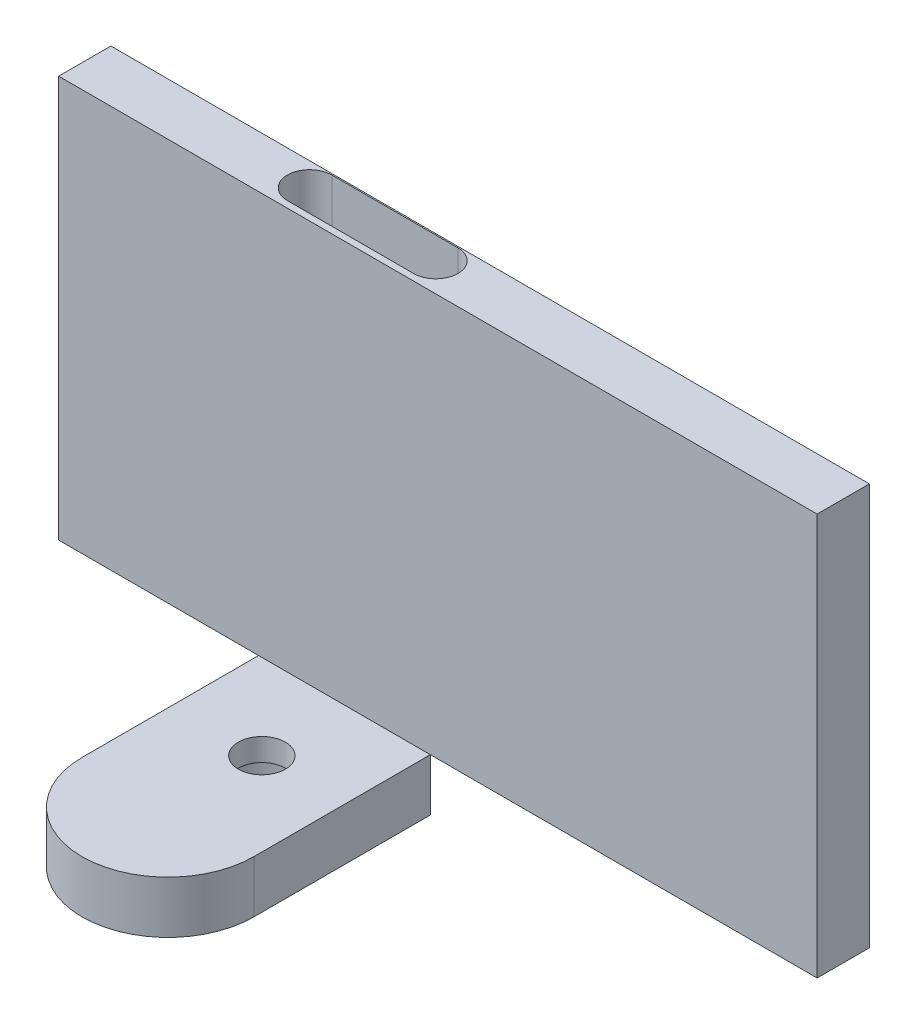
ISO-10303-21;
HEADER;
FILE_DESCRIPTION(('STEP AP214'),'2;1');
FILE_NAME('part.step','',(''),(''),'','','');
FILE_SCHEMA(('AUTOMOTIVE_DESIGN { 1 0 10303 214 1 1 1 1 }'));
ENDSEC;
DATA;
#1=APPLICATION_CONTEXT('core data for automotive mechanical design processes');
#2=APPLICATION_PROTOCOL_DEFINITION('international standard','automotive_design',2000,#1);
#3=PRODUCT_CONTEXT('',#1,'mechanical');
#4=PRODUCT('Part','Part','',(#3));
#5=PRODUCT_RELATED_PRODUCT_CATEGORY('part','',(#4));
#6=PRODUCT_DEFINITION_FORMATION('','',#4);
#7=PRODUCT_DEFINITION_CONTEXT('part definition',#1,'design');
#8=PRODUCT_DEFINITION('design','',#6,#7);
#9=PRODUCT_DEFINITION_SHAPE('','',#8);
#10=(LENGTH_UNIT() NAMED_UNIT(*) SI_UNIT(.MILLI.,.METRE.));
#11=(NAMED_UNIT(*) PLANE_ANGLE_UNIT() SI_UNIT($,.RADIAN.));
#12=(NAMED_UNIT(*) SI_UNIT($,.STERADIAN.) SOLID_ANGLE_UNIT());
#13=UNCERTAINTY_MEASURE_WITH_UNIT(LENGTH_MEASURE(1.E-05),#10,'distance_accuracy_value','');
#14=(GEOMETRIC_REPRESENTATION_CONTEXT(3) GLOBAL_UNCERTAINTY_ASSIGNED_CONTEXT((#13)) GLOBAL_UNIT_ASSIGNED_CONTEXT((#10,
#11,#12)) REPRESENTATION_CONTEXT('',''));
#15=CARTESIAN_POINT('',(0.,0.,0.));
#16=DIRECTION('',(0.,0.,1.));
#17=DIRECTION('',(1.,0.,0.));
#18=AXIS2_PLACEMENT_3D('',#15,#16,#17);
#19=CARTESIAN_POINT('',(0.,0.,0.));
#20=DIRECTION('',(0.,0.,1.));
#21=DIRECTION('',(1.,0.,0.));
#22=AXIS2_PLACEMENT_3D('',#19,#20,#21);
#23=PLANE('',#22);
#24=DIRECTION('',(-1.,0.,0.));
#25=VECTOR('',#24,1.);
#26=CARTESIAN_POINT('',(74.0729850972046,-35.4512730231758,0.));
#27=LINE('',#26,#25);
#28=CARTESIAN_POINT('',(74.0729850972046,-35.4512730231758,0.));
#29=VERTEX_POINT('',#28);
#30=CARTESIAN_POINT('',(-71.1907677782473,-35.4512730231758,0.));
#31=VERTEX_POINT('',#30);
#32=EDGE_CURVE('E408',#29,#31,#27,.T.);
#33=ORIENTED_EDGE('',*,*,#32,.T.);
#34=DIRECTION('',(0.,-1.,0.));
#35=VECTOR('',#34,1.);
#36=CARTESIAN_POINT('',(-71.1907677782473,41.5039293929862,0.));
#37=LINE('',#36,#35);
#38=CARTESIAN_POINT('',(-71.1907677782473,41.5039293929862,0.));
#39=VERTEX_POINT('',#38);
#40=EDGE_CURVE('E423',#39,#31,#37,.T.);
#41=ORIENTED_EDGE('',*,*,#40,.F.);
#42=DIRECTION('',(-1.,0.,0.));
#43=VECTOR('',#42,1.);
#44=CARTESIAN_POINT('',(74.0729850972046,41.5039293929862,0.));
#45=LINE('',#44,#43);
#46=CARTESIAN_POINT('',(74.0729850972046,41.5039293929862,0.));
#47=VERTEX_POINT('',#46);
#48=EDGE_CURVE('E426',#47,#39,#45,.T.);
#49=ORIENTED_EDGE('',*,*,#48,.F.);
#50=DIRECTION('',(0.,-1.,0.));
#51=VECTOR('',#50,1.);
#52=CARTESIAN_POINT('',(74.0729850972046,41.5039293929862,0.));
#53=LINE('',#52,#51);
#54=EDGE_CURVE('E428',#47,#29,#53,.T.);
#55=ORIENTED_EDGE('',*,*,#54,.T.);
#56=EDGE_LOOP('',(#33,#41,#49,#55));
#57=FACE_BOUND('',#56,.T.);
#58=ADVANCED_FACE('F189',(#57),#23,.F.);
#59=CARTESIAN_POINT('',(74.0729850972046,-35.4512730231758,10.));
#60=DIRECTION('',(0.,-1.,0.));
#61=DIRECTION('',(0.,0.,-1.));
#62=AXIS2_PLACEMENT_3D('',#59,#60,#61);
#63=PLANE('',#62);
#64=CARTESIAN_POINT('',(-4.46762105633167,-35.4512730231758,4.49213155720221));
#65=DIRECTION('',(0.,-1.,0.));
#66=DIRECTION('',(0.,0.,-1.));
#67=AXIS2_PLACEMENT_3D('',#64,#65,#66);
#68=CIRCLE('',#67,4.275);
#69=CARTESIAN_POINT('',(-4.46762105633167,-35.4512730231758,0.21713155720221));
#70=VERTEX_POINT('',#69);
#71=CARTESIAN_POINT('',(-4.46762105633167,-35.4512730231758,8.76713155720222));
#72=VERTEX_POINT('',#71);
#73=EDGE_CURVE('E303',#70,#72,#68,.T.);
#74=ORIENTED_EDGE('',*,*,#73,.F.);
#75=DIRECTION('',(1.,0.,0.));
#76=VECTOR('',#75,1.);
#77=CARTESIAN_POINT('',(-28.6420150724124,-35.4512730231758,0.21713155720221));
#78=LINE('',#77,#76);
#79=CARTESIAN_POINT('',(-28.6420150724124,-35.4512730231758,0.217131557202214));
#80=VERTEX_POINT('',#79);
#81=EDGE_CURVE('E334',#80,#70,#78,.T.);
#82=ORIENTED_EDGE('',*,*,#81,.F.);
#83=CARTESIAN_POINT('',(-28.6420150724124,-35.4512730231758,4.49213155720221));
#84=DIRECTION('',(0.,-1.,0.));
#85=DIRECTION('',(0.,0.,-1.));
#86=AXIS2_PLACEMENT_3D('',#83,#84,#85);
#87=CIRCLE('',#86,4.275);
#88=CARTESIAN_POINT('',(-28.6420150724124,-35.4512730231758,8.76713155720222));
#89=VERTEX_POINT('',#88);
#90=EDGE_CURVE('E206',#89,#80,#87,.T.);
#91=ORIENTED_EDGE('',*,*,#90,.F.);
#92=DIRECTION('',(1.,0.,0.));
#93=VECTOR('',#92,1.);
#94=CARTESIAN_POINT('',(-28.6420150724124,-35.4512730231758,8.76713155720222));
#95=LINE('',#94,#93);
#96=EDGE_CURVE('E298',#89,#72,#95,.T.);
#97=ORIENTED_EDGE('',*,*,#96,.T.);
#98=EDGE_LOOP('',(#74,#82,#91,#97));
#99=FACE_BOUND('',#98,.T.);
#100=DIRECTION('',(0.,0.,-1.));
#101=VECTOR('',#100,1.);
#102=CARTESIAN_POINT('',(-71.1907677782473,-35.4512730231758,10.));
#103=LINE('',#102,#101);
#104=CARTESIAN_POINT('',(-71.1907677782473,-35.4512730231758,10.));
#105=VERTEX_POINT('',#104);
#106=EDGE_CURVE('E421',#105,#31,#103,.T.);
#107=ORIENTED_EDGE('',*,*,#106,.T.);
#108=ORIENTED_EDGE('',*,*,#32,.F.);
#109=DIRECTION('',(0.,0.,-1.));
#110=VECTOR('',#109,1.);
#111=CARTESIAN_POINT('',(74.0729850972046,-35.4512730231758,10.));
#112=LINE('',#111,#110);
#113=CARTESIAN_POINT('',(74.0729850972046,-35.4512730231758,10.));
#114=VERTEX_POINT('',#113);
#115=EDGE_CURVE('E13',#114,#29,#112,.T.);
#116=ORIENTED_EDGE('',*,*,#115,.F.);
#117=DIRECTION('',(-1.,0.,0.));
#118=VECTOR('',#117,1.);
#119=CARTESIAN_POINT('',(74.0729850972046,-35.4512730231758,10.));
#120=LINE('',#119,#118);
#121=CARTESIAN_POINT('',(0.,-35.4512730231758,10.));
#122=VERTEX_POINT('',#121);
#123=EDGE_CURVE('E409',#114,#122,#120,.T.);
#124=ORIENTED_EDGE('',*,*,#123,.T.);
#125=DIRECTION('',(-1.,0.,0.));
#126=VECTOR('',#125,1.);
#127=CARTESIAN_POINT('',(-32.9040586827723,-35.4512730231758,10.));
#128=LINE('',#127,#126);
#129=CARTESIAN_POINT('',(-32.9040586827723,-35.4512730231758,10.));
#130=VERTEX_POINT('',#129);
#131=EDGE_CURVE('E359',#122,#130,#128,.T.);
#132=ORIENTED_EDGE('',*,*,#131,.T.);
#133=EDGE_CURVE('E413',#130,#105,#120,.T.);
#134=ORIENTED_EDGE('',*,*,#133,.T.);
#135=EDGE_LOOP('',(#107,#108,#116,#124,#132,#134));
#136=FACE_BOUND('',#135,.T.);
#137=ADVANCED_FACE('F191',(#99,#136),#63,.T.);
#138=CARTESIAN_POINT('',(0.,0.,10.));
#139=DIRECTION('',(0.,0.,1.));
#140=DIRECTION('',(1.,0.,0.));
#141=AXIS2_PLACEMENT_3D('',#138,#139,#140);
#142=PLANE('',#141);
#143=DIRECTION('',(1.,0.,0.));
#144=VECTOR('',#143,1.);
#145=CARTESIAN_POINT('',(0.,-35.4511730231758,10.));
#146=LINE('',#145,#144);
#147=CARTESIAN_POINT('',(-32.9040586827723,-35.4511730231758,10.));
#148=VERTEX_POINT('',#147);
#149=CARTESIAN_POINT('',(0.,-35.4511730231758,10.));
#150=VERTEX_POINT('',#149);
#151=EDGE_CURVE('E397',#148,#150,#146,.T.);
#152=ORIENTED_EDGE('',*,*,#151,.T.);
#153=DIRECTION('',(0.,-1.,0.));
#154=VECTOR('',#153,1.);
#155=CARTESIAN_POINT('',(0.,0.,10.));
#156=LINE('',#155,#154);
#157=EDGE_CURVE('E405',#150,#122,#156,.T.);
#158=ORIENTED_EDGE('',*,*,#157,.T.);
#159=ORIENTED_EDGE('',*,*,#123,.F.);
#160=DIRECTION('',(0.,-1.,0.));
#161=VECTOR('',#160,1.);
#162=CARTESIAN_POINT('',(74.0729850972046,41.5039293929862,10.));
#163=LINE('',#162,#161);
#164=CARTESIAN_POINT('',(74.0729850972046,41.5039293929862,10.));
#165=VERTEX_POINT('',#164);
#166=EDGE_CURVE('E418',#165,#114,#163,.T.);
#167=ORIENTED_EDGE('',*,*,#166,.F.);
#168=DIRECTION('',(-1.,0.,0.));
#169=VECTOR('',#168,1.);
#170=CARTESIAN_POINT('',(74.0729850972046,41.5039293929862,10.));
#171=LINE('',#170,#169);
#172=CARTESIAN_POINT('',(-71.1907677782473,41.5039293929862,10.));
#173=VERTEX_POINT('',#172);
#174=EDGE_CURVE('E416',#165,#173,#171,.T.);
#175=ORIENTED_EDGE('',*,*,#174,.T.);
#176=DIRECTION('',(0.,-1.,0.));
#177=VECTOR('',#176,1.);
#178=CARTESIAN_POINT('',(-71.1907677782473,41.5039293929862,10.));
#179=LINE('',#178,#177);
#180=EDGE_CURVE('E412',#173,#105,#179,.T.);
#181=ORIENTED_EDGE('',*,*,#180,.T.);
#182=ORIENTED_EDGE('',*,*,#133,.F.);
#183=DIRECTION('',(0.,1.,0.));
#184=VECTOR('',#183,1.);
#185=CARTESIAN_POINT('',(-32.9040586827723,0.,10.));
#186=LINE('',#185,#184);
#187=EDGE_CURVE('E402',#130,#148,#186,.T.);
#188=ORIENTED_EDGE('',*,*,#187,.T.);
#189=EDGE_LOOP('',(#152,#158,#159,#167,#175,#181,#182,#188));
#190=FACE_BOUND('',#189,.T.);
#191=ADVANCED_FACE('F452',(#190),#142,.T.);
#192=CARTESIAN_POINT('',(74.0729850972046,41.5039293929862,10.));
#193=DIRECTION('',(1.,0.,0.));
#194=DIRECTION('',(0.,0.,-1.));
#195=AXIS2_PLACEMENT_3D('',#192,#193,#194);
#196=PLANE('',#195);
#197=ORIENTED_EDGE('',*,*,#54,.F.);
#198=DIRECTION('',(0.,0.,-1.));
#199=VECTOR('',#198,1.);
#200=CARTESIAN_POINT('',(74.0729850972046,41.5039293929862,10.));
#201=LINE('',#200,#199);
#202=EDGE_CURVE('E198',#165,#47,#201,.T.);
#203=ORIENTED_EDGE('',*,*,#202,.F.);
#204=ORIENTED_EDGE('',*,*,#166,.T.);
#205=ORIENTED_EDGE('',*,*,#115,.T.);
#206=EDGE_LOOP('',(#197,#203,#204,#205));
#207=FACE_BOUND('',#206,.T.);
#208=ADVANCED_FACE('F447',(#207),#196,.T.);
#209=CARTESIAN_POINT('',(74.0729850972046,41.5039293929862,10.));
#210=DIRECTION('',(0.,-1.,0.));
#211=DIRECTION('',(0.,0.,-1.));
#212=AXIS2_PLACEMENT_3D('',#209,#210,#211);
#213=PLANE('',#212);
#214=DIRECTION('',(1.,0.,0.));
#215=VECTOR('',#214,1.);
#216=CARTESIAN_POINT('',(-28.6420150724124,41.5039293929862,0.242131557202224));
#217=LINE('',#216,#215);
#218=CARTESIAN_POINT('',(-28.6420150724124,41.5039293929862,0.242131557202224));
#219=VERTEX_POINT('',#218);
#220=CARTESIAN_POINT('',(-4.46762105633169,41.5039293929862,0.242131557202223));
#221=VERTEX_POINT('',#220);
#222=EDGE_CURVE('E338',#219,#221,#217,.T.);
#223=ORIENTED_EDGE('',*,*,#222,.T.);
#224=CARTESIAN_POINT('',(-4.46762105633167,41.5039293929862,4.49213155720221));
#225=DIRECTION('',(0.,-1.,0.));
#226=DIRECTION('',(0.,0.,-1.));
#227=AXIS2_PLACEMENT_3D('',#224,#225,#226);
#228=CIRCLE('',#227,4.24999999999999);
#229=CARTESIAN_POINT('',(-4.46762105633167,41.5039293929862,8.7421315572022));
#230=VERTEX_POINT('',#229);
#231=EDGE_CURVE('E316',#221,#230,#228,.T.);
#232=ORIENTED_EDGE('',*,*,#231,.T.);
#233=DIRECTION('',(1.,0.,0.));
#234=VECTOR('',#233,1.);
#235=CARTESIAN_POINT('',(-28.6420150724124,41.5039293929862,8.7421315572022));
#236=LINE('',#235,#234);
#237=CARTESIAN_POINT('',(-28.6420150724124,41.5039293929862,8.7421315572022));
#238=VERTEX_POINT('',#237);
#239=EDGE_CURVE('E340',#238,#230,#236,.T.);
#240=ORIENTED_EDGE('',*,*,#239,.F.);
#241=CARTESIAN_POINT('',(-28.6420150724124,41.5039293929862,4.49213155720221));
#242=DIRECTION('',(0.,-1.,0.));
#243=DIRECTION('',(0.,0.,-1.));
#244=AXIS2_PLACEMENT_3D('',#241,#242,#243);
#245=CIRCLE('',#244,4.24999999999999);
#246=EDGE_CURVE('E351',#238,#219,#245,.T.);
#247=ORIENTED_EDGE('',*,*,#246,.T.);
#248=EDGE_LOOP('',(#223,#232,#240,#247));
#249=FACE_BOUND('',#248,.T.);
#250=ORIENTED_EDGE('',*,*,#48,.T.);
#251=DIRECTION('',(0.,0.,-1.));
#252=VECTOR('',#251,1.);
#253=CARTESIAN_POINT('',(-71.1907677782473,41.5039293929862,10.));
#254=LINE('',#253,#252);
#255=EDGE_CURVE('E432',#173,#39,#254,.T.);
#256=ORIENTED_EDGE('',*,*,#255,.F.);
#257=ORIENTED_EDGE('',*,*,#174,.F.);
#258=ORIENTED_EDGE('',*,*,#202,.T.);
#259=EDGE_LOOP('',(#250,#256,#257,#258));
#260=FACE_BOUND('',#259,.T.);
#261=ADVANCED_FACE('F470',(#249,#260),#213,.F.);
#262=CARTESIAN_POINT('',(-71.1907677782473,41.5039293929862,10.));
#263=DIRECTION('',(1.,0.,0.));
#264=DIRECTION('',(0.,0.,-1.));
#265=AXIS2_PLACEMENT_3D('',#262,#263,#264);
#266=PLANE('',#265);
#267=ORIENTED_EDGE('',*,*,#40,.T.);
#268=ORIENTED_EDGE('',*,*,#106,.F.);
#269=ORIENTED_EDGE('',*,*,#180,.F.);
#270=ORIENTED_EDGE('',*,*,#255,.T.);
#271=EDGE_LOOP('',(#267,#268,#269,#270));
#272=FACE_BOUND('',#271,.T.);
#273=ADVANCED_FACE('F441',(#272),#266,.F.);
#274=CARTESIAN_POINT('',(-16.4520293413862,-35.4511730231758,43.814743914188));
#275=DIRECTION('',(0.,-1.,0.));
#276=DIRECTION('',(0.,0.,-1.));
#277=AXIS2_PLACEMENT_3D('',#274,#275,#276);
#278=CYLINDRICAL_SURFACE('',#277,16.4520293413862);
#279=DIRECTION('',(0.,-1.,0.));
#280=VECTOR('',#279,1.);
#281=CARTESIAN_POINT('',(-32.9040586827723,-35.4511730231758,43.814743914188));
#282=LINE('',#281,#280);
#283=CARTESIAN_POINT('',(-32.9040586827723,-35.4511730231758,43.814743914188));
#284=VERTEX_POINT('',#283);
#285=CARTESIAN_POINT('',(-32.9040586827723,-45.4512730231758,43.814743914188));
#286=VERTEX_POINT('',#285);
#287=EDGE_CURVE('E394',#284,#286,#282,.T.);
#288=ORIENTED_EDGE('',*,*,#287,.T.);
#289=CARTESIAN_POINT('',(-16.4520293413862,-45.4512730231758,43.814743914188));
#290=DIRECTION('',(0.,-1.,0.));
#291=DIRECTION('',(0.,0.,-1.));
#292=AXIS2_PLACEMENT_3D('',#289,#290,#291);
#293=CIRCLE('',#292,16.4520293413862);
#294=CARTESIAN_POINT('',(0.,-45.4512730231758,43.814743914188));
#295=VERTEX_POINT('',#294);
#296=EDGE_CURVE('E379',#286,#295,#293,.F.);
#297=ORIENTED_EDGE('',*,*,#296,.T.);
#298=DIRECTION('',(0.,-1.,0.));
#299=VECTOR('',#298,1.);
#300=CARTESIAN_POINT('',(0.,-35.4511730231758,43.814743914188));
#301=LINE('',#300,#299);
#302=CARTESIAN_POINT('',(0.,-35.4511730231758,43.814743914188));
#303=VERTEX_POINT('',#302);
#304=EDGE_CURVE('E395',#303,#295,#301,.T.);
#305=ORIENTED_EDGE('',*,*,#304,.F.);
#306=CARTESIAN_POINT('',(-16.4520293413862,-35.4511730231758,43.814743914188));
#307=DIRECTION('',(0.,-1.,0.));
#308=DIRECTION('',(0.,0.,-1.));
#309=AXIS2_PLACEMENT_3D('',#306,#307,#308);
#310=CIRCLE('',#309,16.4520293413862);
#311=EDGE_CURVE('E387',#284,#303,#310,.F.);
#312=ORIENTED_EDGE('',*,*,#311,.F.);
#313=EDGE_LOOP('',(#288,#297,#305,#312));
#314=FACE_BOUND('',#313,.T.);
#315=ADVANCED_FACE('F478',(#314),#278,.T.);
#316=CARTESIAN_POINT('',(0.,-35.4511730231758,0.));
#317=DIRECTION('',(-1.,0.,0.));
#318=DIRECTION('',(0.,0.,1.));
#319=AXIS2_PLACEMENT_3D('',#316,#317,#318);
#320=PLANE('',#319);
#321=DIRECTION('',(0.,0.,-1.));
#322=VECTOR('',#321,1.);
#323=CARTESIAN_POINT('',(0.,-45.4512730231758,0.));
#324=LINE('',#323,#322);
#325=CARTESIAN_POINT('',(0.,-45.4512730231758,10.));
#326=VERTEX_POINT('',#325);
#327=EDGE_CURVE('E384',#295,#326,#324,.T.);
#328=ORIENTED_EDGE('',*,*,#327,.T.);
#329=DIRECTION('',(0.,-1.,0.));
#330=VECTOR('',#329,1.);
#331=CARTESIAN_POINT('',(0.,-35.4512730231758,10.));
#332=LINE('',#331,#330);
#333=EDGE_CURVE('E214',#122,#326,#332,.T.);
#334=ORIENTED_EDGE('',*,*,#333,.F.);
#335=ORIENTED_EDGE('',*,*,#157,.F.);
#336=DIRECTION('',(0.,0.,-1.));
#337=VECTOR('',#336,1.);
#338=CARTESIAN_POINT('',(0.,-35.4511730231758,0.));
#339=LINE('',#338,#337);
#340=EDGE_CURVE('E392',#303,#150,#339,.T.);
#341=ORIENTED_EDGE('',*,*,#340,.F.);
#342=ORIENTED_EDGE('',*,*,#304,.T.);
#343=EDGE_LOOP('',(#328,#334,#335,#341,#342));
#344=FACE_BOUND('',#343,.T.);
#345=ADVANCED_FACE('F455',(#344),#320,.F.);
#346=CARTESIAN_POINT('',(-32.9040586827723,-35.4511730231758,0.));
#347=DIRECTION('',(1.,0.,0.));
#348=DIRECTION('',(0.,0.,-1.));
#349=AXIS2_PLACEMENT_3D('',#346,#347,#348);
#350=PLANE('',#349);
#351=ORIENTED_EDGE('',*,*,#187,.F.);
#352=DIRECTION('',(0.,-1.,0.));
#353=VECTOR('',#352,1.);
#354=CARTESIAN_POINT('',(-32.9040586827723,-35.4512730231758,10.));
#355=LINE('',#354,#353);
#356=CARTESIAN_POINT('',(-32.9040586827723,-45.4512730231758,10.));
#357=VERTEX_POINT('',#356);
#358=EDGE_CURVE('E363',#130,#357,#355,.T.);
#359=ORIENTED_EDGE('',*,*,#358,.T.);
#360=DIRECTION('',(0.,0.,1.));
#361=VECTOR('',#360,1.);
#362=CARTESIAN_POINT('',(-32.9040586827723,-45.4512730231758,0.));
#363=LINE('',#362,#361);
#364=EDGE_CURVE('E382',#357,#286,#363,.T.);
#365=ORIENTED_EDGE('',*,*,#364,.T.);
#366=ORIENTED_EDGE('',*,*,#287,.F.);
#367=DIRECTION('',(0.,0.,1.));
#368=VECTOR('',#367,1.);
#369=CARTESIAN_POINT('',(-32.9040586827723,-35.4511730231758,0.));
#370=LINE('',#369,#368);
#371=EDGE_CURVE('E390',#148,#284,#370,.T.);
#372=ORIENTED_EDGE('',*,*,#371,.F.);
#373=EDGE_LOOP('',(#351,#359,#365,#366,#372));
#374=FACE_BOUND('',#373,.T.);
#375=ADVANCED_FACE('F466',(#374),#350,.F.);
#376=CARTESIAN_POINT('',(0.,-35.4511730231758,0.));
#377=DIRECTION('',(0.,-1.,0.));
#378=DIRECTION('',(0.,0.,-1.));
#379=AXIS2_PLACEMENT_3D('',#376,#377,#378);
#380=PLANE('',#379);
#381=CARTESIAN_POINT('',(-15.9807895847734,-35.4511730231758,26.2979657006071));
#382=DIRECTION('',(0.,-1.,0.));
#383=DIRECTION('',(0.,0.,-1.));
#384=AXIS2_PLACEMENT_3D('',#381,#382,#383);
#385=CIRCLE('',#384,4.49999999999999);
#386=CARTESIAN_POINT('',(-15.9807895847734,-35.4511730231758,21.7979657006071));
#387=VERTEX_POINT('',#386);
#388=EDGE_CURVE('E193',#387,#387,#385,.T.);
#389=ORIENTED_EDGE('',*,*,#388,.T.);
#390=EDGE_LOOP('',(#389));
#391=FACE_BOUND('',#390,.T.);
#392=ORIENTED_EDGE('',*,*,#151,.F.);
#393=ORIENTED_EDGE('',*,*,#371,.T.);
#394=ORIENTED_EDGE('',*,*,#311,.T.);
#395=ORIENTED_EDGE('',*,*,#340,.T.);
#396=EDGE_LOOP('',(#392,#393,#394,#395));
#397=FACE_BOUND('',#396,.T.);
#398=ADVANCED_FACE('F493',(#391,#397),#380,.F.);
#399=CARTESIAN_POINT('',(0.,-45.4512730231758,0.));
#400=DIRECTION('',(0.,-1.,0.));
#401=DIRECTION('',(0.,0.,-1.));
#402=AXIS2_PLACEMENT_3D('',#399,#400,#401);
#403=PLANE('',#402);
#404=DIRECTION('',(-1.,0.,0.));
#405=VECTOR('',#404,1.);
#406=CARTESIAN_POINT('',(-32.9040586827723,-45.4512730231758,10.));
#407=LINE('',#406,#405);
#408=EDGE_CURVE('E358',#326,#357,#407,.T.);
#409=ORIENTED_EDGE('',*,*,#408,.F.);
#410=ORIENTED_EDGE('',*,*,#327,.F.);
#411=ORIENTED_EDGE('',*,*,#296,.F.);
#412=ORIENTED_EDGE('',*,*,#364,.F.);
#413=EDGE_LOOP('',(#409,#410,#411,#412));
#414=FACE_BOUND('',#413,.T.);
#415=CARTESIAN_POINT('',(-15.9807895847734,-45.4512730231758,26.2979657006071));
#416=DIRECTION('',(0.,-1.,0.));
#417=DIRECTION('',(0.,0.,-1.));
#418=AXIS2_PLACEMENT_3D('',#415,#416,#417);
#419=CIRCLE('',#418,9.03);
#420=CARTESIAN_POINT('',(-15.9807895847734,-45.4512730231758,17.267965700607));
#421=VERTEX_POINT('',#420);
#422=EDGE_CURVE('E366',#421,#421,#419,.T.);
#423=ORIENTED_EDGE('',*,*,#422,.F.);
#424=EDGE_LOOP('',(#423));
#425=FACE_BOUND('',#424,.T.);
#426=ADVANCED_FACE('F460',(#414,#425),#403,.T.);
#427=CARTESIAN_POINT('',(-15.9807895847734,-45.4512730231758,26.2979657006071));
#428=DIRECTION('',(0.,-1.,0.));
#429=DIRECTION('',(0.,0.,-1.));
#430=AXIS2_PLACEMENT_3D('',#427,#428,#429);
#431=CYLINDRICAL_SURFACE('',#430,4.49999999999999);
#432=CARTESIAN_POINT('',(-15.9807895847734,-39.7712730231758,26.2979657006071));
#433=DIRECTION('',(0.,-1.,0.));
#434=DIRECTION('',(0.,0.,-1.));
#435=AXIS2_PLACEMENT_3D('',#432,#433,#434);
#436=CIRCLE('',#435,4.5);
#437=CARTESIAN_POINT('',(-15.9807895847734,-39.7712730231758,21.7979657006071));
#438=VERTEX_POINT('',#437);
#439=EDGE_CURVE('E376',#438,#438,#436,.T.);
#440=ORIENTED_EDGE('',*,*,#439,.T.);
#441=EDGE_LOOP('',(#440));
#442=FACE_BOUND('',#441,.T.);
#443=ORIENTED_EDGE('',*,*,#388,.F.);
#444=EDGE_LOOP('',(#443));
#445=FACE_BOUND('',#444,.T.);
#446=ADVANCED_FACE('F501',(#442,#445),#431,.F.);
#447=CARTESIAN_POINT('',(-6.97578958477345,-39.7712730231758,26.2979657006071));
#448=DIRECTION('',(0.,1.,0.));
#449=DIRECTION('',(0.,0.,1.));
#450=AXIS2_PLACEMENT_3D('',#447,#448,#449);
#451=PLANE('',#450);
#452=ORIENTED_EDGE('',*,*,#439,.F.);
#453=EDGE_LOOP('',(#452));
#454=FACE_BOUND('',#453,.T.);
#455=CARTESIAN_POINT('',(-15.9807895847734,-39.7712730231758,26.2979657006071));
#456=DIRECTION('',(0.,-1.,0.));
#457=DIRECTION('',(0.,0.,-1.));
#458=AXIS2_PLACEMENT_3D('',#455,#456,#457);
#459=CIRCLE('',#458,9.005);
#460=CARTESIAN_POINT('',(-15.9807895847734,-39.7712730231758,17.2929657006071));
#461=VERTEX_POINT('',#460);
#462=EDGE_CURVE('E373',#461,#461,#459,.T.);
#463=ORIENTED_EDGE('',*,*,#462,.T.);
#464=EDGE_LOOP('',(#463));
#465=FACE_BOUND('',#464,.T.);
#466=ADVANCED_FACE('F504',(#454,#465),#451,.F.);
#467=CARTESIAN_POINT('',(-15.9807895847734,-45.4512730231758,26.2979657006071));
#468=DIRECTION('',(0.,-1.,0.));
#469=DIRECTION('',(0.,0.,-1.));
#470=AXIS2_PLACEMENT_3D('',#467,#468,#469);
#471=CYLINDRICAL_SURFACE('',#470,9.005);
#472=ORIENTED_EDGE('',*,*,#462,.F.);
#473=EDGE_LOOP('',(#472));
#474=FACE_BOUND('',#473,.T.);
#475=CARTESIAN_POINT('',(-15.9807895847734,-45.4262730231758,26.2979657006071));
#476=DIRECTION('',(0.,-1.,0.));
#477=DIRECTION('',(0.,0.,-1.));
#478=AXIS2_PLACEMENT_3D('',#475,#476,#477);
#479=CIRCLE('',#478,9.005);
#480=CARTESIAN_POINT('',(-15.9807895847734,-45.4262730231758,17.292965700607));
#481=VERTEX_POINT('',#480);
#482=EDGE_CURVE('E370',#481,#481,#479,.T.);
#483=ORIENTED_EDGE('',*,*,#482,.T.);
#484=EDGE_LOOP('',(#483));
#485=FACE_BOUND('',#484,.T.);
#486=ADVANCED_FACE('F508',(#474,#485),#471,.F.);
#487=CARTESIAN_POINT('',(-15.9807895847734,-45.4512730231758,26.2979657006071));
#488=DIRECTION('',(0.,-1.,0.));
#489=DIRECTION('',(0.,0.,-1.));
#490=AXIS2_PLACEMENT_3D('',#487,#488,#489);
#491=CONICAL_SURFACE('',#490,9.03,0.785398163397414);
#492=ORIENTED_EDGE('',*,*,#482,.F.);
#493=EDGE_LOOP('',(#492));
#494=FACE_BOUND('',#493,.T.);
#495=ORIENTED_EDGE('',*,*,#422,.T.);
#496=EDGE_LOOP('',(#495));
#497=FACE_BOUND('',#496,.T.);
#498=ADVANCED_FACE('F512',(#494,#497),#491,.F.);
#499=CARTESIAN_POINT('',(-32.9040586827723,-35.4512730231758,10.));
#500=DIRECTION('',(0.,0.,1.));
#501=DIRECTION('',(1.,0.,0.));
#502=AXIS2_PLACEMENT_3D('',#499,#500,#501);
#503=PLANE('',#502);
#504=ORIENTED_EDGE('',*,*,#408,.T.);
#505=ORIENTED_EDGE('',*,*,#358,.F.);
#506=ORIENTED_EDGE('',*,*,#131,.F.);
#507=ORIENTED_EDGE('',*,*,#333,.T.);
#508=EDGE_LOOP('',(#504,#505,#506,#507));
#509=FACE_BOUND('',#508,.T.);
#510=ADVANCED_FACE('F463',(#509),#503,.F.);
#511=CARTESIAN_POINT('',(-28.6420150724124,-35.4512730231758,4.49213155720221));
#512=DIRECTION('',(0.,-1.,0.));
#513=DIRECTION('',(0.,0.,-1.));
#514=AXIS2_PLACEMENT_3D('',#511,#512,#513);
#515=CYLINDRICAL_SURFACE('',#514,4.24999999999999);
#516=CARTESIAN_POINT('',(-28.6420150724124,-35.4262730231758,4.49213155720221));
#517=DIRECTION('',(0.,-1.,0.));
#518=DIRECTION('',(0.,0.,-1.));
#519=AXIS2_PLACEMENT_3D('',#516,#517,#518);
#520=CIRCLE('',#519,4.24999999999999);
#521=CARTESIAN_POINT('',(-28.6420150724124,-35.4262730231758,8.7421315572022));
#522=VERTEX_POINT('',#521);
#523=CARTESIAN_POINT('',(-28.6420150724124,-35.4262730231758,0.242131557202224));
#524=VERTEX_POINT('',#523);
#525=EDGE_CURVE('E348',#522,#524,#520,.T.);
#526=ORIENTED_EDGE('',*,*,#525,.T.);
#527=DIRECTION('',(0.,-1.,0.));
#528=VECTOR('',#527,1.);
#529=CARTESIAN_POINT('',(-28.6420150724124,-35.4512730231758,0.242131557202224));
#530=LINE('',#529,#528);
#531=EDGE_CURVE('E306',#219,#524,#530,.T.);
#532=ORIENTED_EDGE('',*,*,#531,.F.);
#533=ORIENTED_EDGE('',*,*,#246,.F.);
#534=DIRECTION('',(0.,-1.,0.));
#535=VECTOR('',#534,1.);
#536=CARTESIAN_POINT('',(-28.6420150724124,-35.4512730231758,8.7421315572022));
#537=LINE('',#536,#535);
#538=EDGE_CURVE('E345',#522,#238,#537,.F.);
#539=ORIENTED_EDGE('',*,*,#538,.F.);
#540=EDGE_LOOP('',(#526,#532,#533,#539));
#541=FACE_BOUND('',#540,.T.);
#542=ADVANCED_FACE('F519',(#541),#515,.F.);
#543=CARTESIAN_POINT('',(-28.6420150724124,-35.4512730231758,4.49213155720221));
#544=DIRECTION('',(0.,-1.,0.));
#545=DIRECTION('',(0.,0.,-1.));
#546=AXIS2_PLACEMENT_3D('',#543,#544,#545);
#547=CONICAL_SURFACE('',#546,4.275,0.785398163397726);
#548=ORIENTED_EDGE('',*,*,#90,.T.);
#549=DIRECTION('',(0.,0.707106781186351,0.707106781186744));
#550=VECTOR('',#549,1.);
#551=CARTESIAN_POINT('',(-28.6420150724124,-31.1762730231781,4.49213155720221));
#552=LINE('',#551,#550);
#553=EDGE_CURVE('E354',#524,#80,#552,.F.);
#554=ORIENTED_EDGE('',*,*,#553,.F.);
#555=ORIENTED_EDGE('',*,*,#525,.F.);
#556=DIRECTION('',(0.,-0.707106781186351,0.707106781186744));
#557=VECTOR('',#556,1.);
#558=CARTESIAN_POINT('',(-28.6420150724124,-31.1762730231781,4.49213155720221));
#559=LINE('',#558,#557);
#560=EDGE_CURVE('E356',#89,#522,#559,.F.);
#561=ORIENTED_EDGE('',*,*,#560,.F.);
#562=EDGE_LOOP('',(#548,#554,#555,#561));
#563=FACE_BOUND('',#562,.T.);
#564=ADVANCED_FACE('F522',(#563),#547,.F.);
#565=CARTESIAN_POINT('',(-28.6420150724124,-31.1762730231781,4.49213155720221));
#566=DIRECTION('',(0.,0.707106781186744,0.707106781186351));
#567=DIRECTION('',(0.,-0.707106781186351,0.707106781186744));
#568=AXIS2_PLACEMENT_3D('',#565,#566,#567);
#569=PLANE('',#568);
#570=DIRECTION('',(0.,0.707106781186327,-0.707106781186768));
#571=VECTOR('',#570,1.);
#572=CARTESIAN_POINT('',(-4.46762105633167,-31.1762730231784,4.49213155720221));
#573=LINE('',#572,#571);
#574=CARTESIAN_POINT('',(-4.46762105633167,-35.4262730231758,8.7421315572022));
#575=VERTEX_POINT('',#574);
#576=EDGE_CURVE('E310',#575,#72,#573,.F.);
#577=ORIENTED_EDGE('',*,*,#576,.T.);
#578=ORIENTED_EDGE('',*,*,#96,.F.);
#579=ORIENTED_EDGE('',*,*,#560,.T.);
#580=DIRECTION('',(1.,0.,0.));
#581=VECTOR('',#580,1.);
#582=CARTESIAN_POINT('',(-28.6420150724124,-35.4262730231758,8.7421315572022));
#583=LINE('',#582,#581);
#584=EDGE_CURVE('E307',#522,#575,#583,.T.);
#585=ORIENTED_EDGE('',*,*,#584,.T.);
#586=EDGE_LOOP('',(#577,#578,#579,#585));
#587=FACE_BOUND('',#586,.T.);
#588=ADVANCED_FACE('F311',(#587),#569,.F.);
#589=CARTESIAN_POINT('',(-28.6420150724124,-35.4512730231758,8.7421315572022));
#590=DIRECTION('',(0.,0.,1.));
#591=DIRECTION('',(1.,0.,0.));
#592=AXIS2_PLACEMENT_3D('',#589,#590,#591);
#593=PLANE('',#592);
#594=DIRECTION('',(0.,-1.,0.));
#595=VECTOR('',#594,1.);
#596=CARTESIAN_POINT('',(-4.46762105633167,-35.4512730231758,8.7421315572022));
#597=LINE('',#596,#595);
#598=EDGE_CURVE('E327',#230,#575,#597,.T.);
#599=ORIENTED_EDGE('',*,*,#598,.T.);
#600=ORIENTED_EDGE('',*,*,#584,.F.);
#601=ORIENTED_EDGE('',*,*,#538,.T.);
#602=ORIENTED_EDGE('',*,*,#239,.T.);
#603=EDGE_LOOP('',(#599,#600,#601,#602));
#604=FACE_BOUND('',#603,.T.);
#605=ADVANCED_FACE('F528',(#604),#593,.F.);
#606=CARTESIAN_POINT('',(-28.6420150724124,-35.4512730231758,0.242131557202224));
#607=DIRECTION('',(0.,0.,-1.));
#608=DIRECTION('',(-1.,0.,0.));
#609=AXIS2_PLACEMENT_3D('',#606,#607,#608);
#610=PLANE('',#609);
#611=DIRECTION('',(0.,-1.,0.));
#612=VECTOR('',#611,1.);
#613=CARTESIAN_POINT('',(-4.46762105633167,-35.4512730231758,0.242131557202224));
#614=LINE('',#613,#612);
#615=CARTESIAN_POINT('',(-4.46762105633167,-35.4262730231758,0.242131557202224));
#616=VERTEX_POINT('',#615);
#617=EDGE_CURVE('E322',#616,#221,#614,.F.);
#618=ORIENTED_EDGE('',*,*,#617,.T.);
#619=ORIENTED_EDGE('',*,*,#222,.F.);
#620=ORIENTED_EDGE('',*,*,#531,.T.);
#621=DIRECTION('',(1.,0.,0.));
#622=VECTOR('',#621,1.);
#623=CARTESIAN_POINT('',(-28.6420150724124,-35.4262730231758,0.242131557202224));
#624=LINE('',#623,#622);
#625=EDGE_CURVE('E336',#524,#616,#624,.T.);
#626=ORIENTED_EDGE('',*,*,#625,.T.);
#627=EDGE_LOOP('',(#618,#619,#620,#626));
#628=FACE_BOUND('',#627,.T.);
#629=ADVANCED_FACE('F531',(#628),#610,.F.);
#630=CARTESIAN_POINT('',(-28.6420150724124,-31.1762730231781,4.49213155720221));
#631=DIRECTION('',(0.,0.707106781186744,-0.707106781186351));
#632=DIRECTION('',(0.,0.707106781186351,0.707106781186744));
#633=AXIS2_PLACEMENT_3D('',#630,#631,#632);
#634=PLANE('',#633);
#635=DIRECTION('',(0.,-0.707106781186327,-0.707106781186768));
#636=VECTOR('',#635,1.);
#637=CARTESIAN_POINT('',(-4.46762105633167,-31.1762730231784,4.49213155720221));
#638=LINE('',#637,#636);
#639=EDGE_CURVE('E315',#70,#616,#638,.F.);
#640=ORIENTED_EDGE('',*,*,#639,.T.);
#641=ORIENTED_EDGE('',*,*,#625,.F.);
#642=ORIENTED_EDGE('',*,*,#553,.T.);
#643=ORIENTED_EDGE('',*,*,#81,.T.);
#644=EDGE_LOOP('',(#640,#641,#642,#643));
#645=FACE_BOUND('',#644,.T.);
#646=ADVANCED_FACE('F535',(#645),#634,.F.);
#647=CARTESIAN_POINT('',(-4.46762105633167,-35.4512730231758,4.49213155720221));
#648=DIRECTION('',(0.,-1.,0.));
#649=DIRECTION('',(0.,0.,-1.));
#650=AXIS2_PLACEMENT_3D('',#647,#648,#649);
#651=CYLINDRICAL_SURFACE('',#650,4.24999999999999);
#652=ORIENTED_EDGE('',*,*,#231,.F.);
#653=ORIENTED_EDGE('',*,*,#617,.F.);
#654=CARTESIAN_POINT('',(-4.46762105633167,-35.4262730231758,4.49213155720221));
#655=DIRECTION('',(0.,-1.,0.));
#656=DIRECTION('',(0.,0.,-1.));
#657=AXIS2_PLACEMENT_3D('',#654,#655,#656);
#658=CIRCLE('',#657,4.24999999999999);
#659=EDGE_CURVE('E321',#616,#575,#658,.T.);
#660=ORIENTED_EDGE('',*,*,#659,.T.);
#661=ORIENTED_EDGE('',*,*,#598,.F.);
#662=EDGE_LOOP('',(#652,#653,#660,#661));
#663=FACE_BOUND('',#662,.T.);
#664=ADVANCED_FACE('F539',(#663),#651,.F.);
#665=CARTESIAN_POINT('',(-4.46762105633167,-35.4512730231758,4.49213155720221));
#666=DIRECTION('',(0.,-1.,0.));
#667=DIRECTION('',(0.,0.,-1.));
#668=AXIS2_PLACEMENT_3D('',#665,#666,#667);
#669=CONICAL_SURFACE('',#668,4.275,0.78539816339776);
#670=ORIENTED_EDGE('',*,*,#659,.F.);
#671=ORIENTED_EDGE('',*,*,#639,.F.);
#672=ORIENTED_EDGE('',*,*,#73,.T.);
#673=ORIENTED_EDGE('',*,*,#576,.F.);
#674=EDGE_LOOP('',(#670,#671,#672,#673));
#675=FACE_BOUND('',#674,.T.);
#676=ADVANCED_FACE('F319',(#675),#669,.F.);
#677=CLOSED_SHELL('',(#58,#137,#191,#208,#261,#273,#315,#345,#375,#398,#426,#446,#466,#486,#498,
#510,#542,#564,#588,#605,#629,#646,#664,#676));
#678=MANIFOLD_SOLID_BREP('B2',#677);
#679=ADVANCED_BREP_SHAPE_REPRESENTATION('',(#18,#678),#14);
#680=SHAPE_DEFINITION_REPRESENTATION(#9,#679);
ENDSEC;
END-ISO-10303-21;
